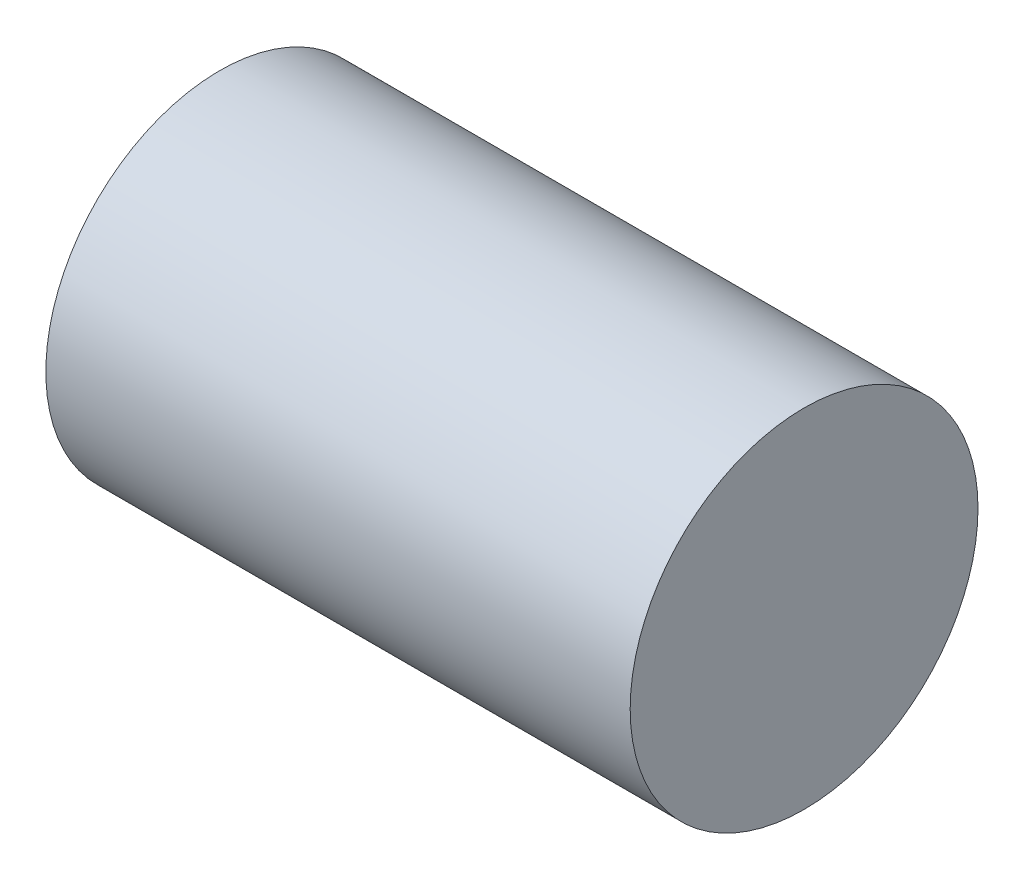
ISO-10303-21;
HEADER;
FILE_DESCRIPTION(('STEP AP214'),'2;1');
FILE_NAME('part.step','',(''),(''),'','','');
FILE_SCHEMA(('AUTOMOTIVE_DESIGN { 1 0 10303 214 1 1 1 1 }'));
ENDSEC;
DATA;
#1=APPLICATION_CONTEXT('core data for automotive mechanical design processes');
#2=APPLICATION_PROTOCOL_DEFINITION('international standard','automotive_design',2000,#1);
#3=PRODUCT_CONTEXT('',#1,'mechanical');
#4=PRODUCT('Part','Part','',(#3));
#5=PRODUCT_RELATED_PRODUCT_CATEGORY('part','',(#4));
#6=PRODUCT_DEFINITION_FORMATION('','',#4);
#7=PRODUCT_DEFINITION_CONTEXT('part definition',#1,'design');
#8=PRODUCT_DEFINITION('design','',#6,#7);
#9=PRODUCT_DEFINITION_SHAPE('','',#8);
#10=(LENGTH_UNIT() NAMED_UNIT(*) SI_UNIT(.MILLI.,.METRE.));
#11=(NAMED_UNIT(*) PLANE_ANGLE_UNIT() SI_UNIT($,.RADIAN.));
#12=(NAMED_UNIT(*) SI_UNIT($,.STERADIAN.) SOLID_ANGLE_UNIT());
#13=UNCERTAINTY_MEASURE_WITH_UNIT(LENGTH_MEASURE(1.E-05),#10,'distance_accuracy_value','');
#14=(GEOMETRIC_REPRESENTATION_CONTEXT(3) GLOBAL_UNCERTAINTY_ASSIGNED_CONTEXT((#13)) GLOBAL_UNIT_ASSIGNED_CONTEXT((#10,
#11,#12)) REPRESENTATION_CONTEXT('',''));
#15=CARTESIAN_POINT('',(0.,0.,0.));
#16=DIRECTION('',(0.,0.,1.));
#17=DIRECTION('',(1.,0.,0.));
#18=AXIS2_PLACEMENT_3D('',#15,#16,#17);
#19=CARTESIAN_POINT('',(8.4,0.,0.));
#20=DIRECTION('',(1.,0.,0.));
#21=DIRECTION('',(0.,0.,-1.));
#22=AXIS2_PLACEMENT_3D('',#19,#20,#21);
#23=PLANE('',#22);
#24=CARTESIAN_POINT('',(8.4,0.,0.));
#25=DIRECTION('',(-1.,0.,0.));
#26=DIRECTION('',(0.,0.,1.));
#27=AXIS2_PLACEMENT_3D('',#24,#25,#26);
#28=CIRCLE('',#27,5.);
#29=CARTESIAN_POINT('',(8.4,0.,5.));
#30=VERTEX_POINT('',#29);
#31=EDGE_CURVE('E9',#30,#30,#28,.T.);
#32=ORIENTED_EDGE('',*,*,#31,.F.);
#33=EDGE_LOOP('',(#32));
#34=FACE_BOUND('',#33,.T.);
#35=ADVANCED_FACE('F14',(#34),#23,.T.);
#36=CARTESIAN_POINT('',(-8.4,0.,0.));
#37=DIRECTION('',(-1.,0.,0.));
#38=DIRECTION('',(0.,0.,1.));
#39=AXIS2_PLACEMENT_3D('',#36,#37,#38);
#40=PLANE('',#39);
#41=CARTESIAN_POINT('',(-8.4,0.,0.));
#42=DIRECTION('',(1.,0.,0.));
#43=DIRECTION('',(0.,0.,-1.));
#44=AXIS2_PLACEMENT_3D('',#41,#42,#43);
#45=CIRCLE('',#44,5.);
#46=CARTESIAN_POINT('',(-8.4,0.,-5.));
#47=VERTEX_POINT('',#46);
#48=EDGE_CURVE('E21',#47,#47,#45,.T.);
#49=ORIENTED_EDGE('',*,*,#48,.F.);
#50=EDGE_LOOP('',(#49));
#51=FACE_BOUND('',#50,.T.);
#52=ADVANCED_FACE('F28',(#51),#40,.T.);
#53=CARTESIAN_POINT('',(-8.4,0.,0.));
#54=DIRECTION('',(1.,0.,0.));
#55=DIRECTION('',(0.,0.,-1.));
#56=AXIS2_PLACEMENT_3D('',#53,#54,#55);
#57=CYLINDRICAL_SURFACE('',#56,5.);
#58=ORIENTED_EDGE('',*,*,#31,.T.);
#59=EDGE_LOOP('',(#58));
#60=FACE_BOUND('',#59,.T.);
#61=ORIENTED_EDGE('',*,*,#48,.T.);
#62=EDGE_LOOP('',(#61));
#63=FACE_BOUND('',#62,.T.);
#64=ADVANCED_FACE('F16',(#60,#63),#57,.T.);
#65=CLOSED_SHELL('',(#35,#52,#64));
#66=MANIFOLD_SOLID_BREP('B1',#65);
#67=ADVANCED_BREP_SHAPE_REPRESENTATION('',(#18,#66),#14);
#68=SHAPE_DEFINITION_REPRESENTATION(#9,#67);
ENDSEC;
END-ISO-10303-21;
